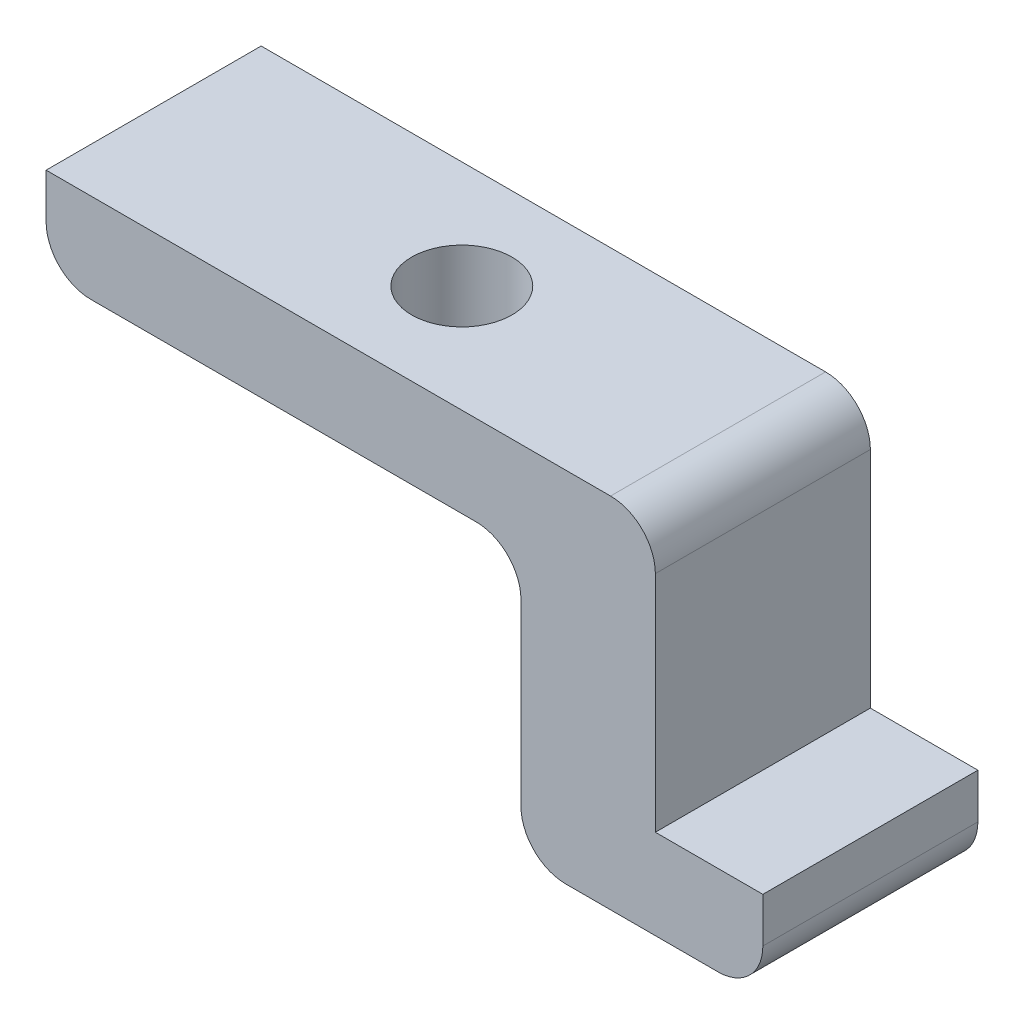
ISO-10303-21;
HEADER;
FILE_DESCRIPTION(('STEP AP214'),'2;1');
FILE_NAME('part.step','',(''),(''),'','','');
FILE_SCHEMA(('AUTOMOTIVE_DESIGN { 1 0 10303 214 1 1 1 1 }'));
ENDSEC;
DATA;
#1=APPLICATION_CONTEXT('core data for automotive mechanical design processes');
#2=APPLICATION_PROTOCOL_DEFINITION('international standard','automotive_design',2000,#1);
#3=PRODUCT_CONTEXT('',#1,'mechanical');
#4=PRODUCT('Part','Part','',(#3));
#5=PRODUCT_RELATED_PRODUCT_CATEGORY('part','',(#4));
#6=PRODUCT_DEFINITION_FORMATION('','',#4);
#7=PRODUCT_DEFINITION_CONTEXT('part definition',#1,'design');
#8=PRODUCT_DEFINITION('design','',#6,#7);
#9=PRODUCT_DEFINITION_SHAPE('','',#8);
#10=(LENGTH_UNIT() NAMED_UNIT(*) SI_UNIT(.MILLI.,.METRE.));
#11=(NAMED_UNIT(*) PLANE_ANGLE_UNIT() SI_UNIT($,.RADIAN.));
#12=(NAMED_UNIT(*) SI_UNIT($,.STERADIAN.) SOLID_ANGLE_UNIT());
#13=UNCERTAINTY_MEASURE_WITH_UNIT(LENGTH_MEASURE(1.E-05),#10,'distance_accuracy_value','');
#14=(GEOMETRIC_REPRESENTATION_CONTEXT(3) GLOBAL_UNCERTAINTY_ASSIGNED_CONTEXT((#13)) GLOBAL_UNIT_ASSIGNED_CONTEXT((#10,
#11,#12)) REPRESENTATION_CONTEXT('',''));
#15=CARTESIAN_POINT('',(0.,0.,0.));
#16=DIRECTION('',(0.,0.,1.));
#17=DIRECTION('',(1.,0.,0.));
#18=AXIS2_PLACEMENT_3D('',#15,#16,#17);
#19=CARTESIAN_POINT('',(-4.7625,-3.175,7.62));
#20=DIRECTION('',(0.,1.,0.));
#21=DIRECTION('',(0.,0.,1.));
#22=AXIS2_PLACEMENT_3D('',#19,#20,#21);
#23=PLANE('',#22);
#24=DIRECTION('',(1.,0.,0.));
#25=VECTOR('',#24,1.);
#26=CARTESIAN_POINT('',(-4.7625,-3.175,0.));
#27=LINE('',#26,#25);
#28=CARTESIAN_POINT('',(-3.175,-3.175,0.));
#29=VERTEX_POINT('',#28);
#30=CARTESIAN_POINT('',(2.2225,-3.175,0.));
#31=VERTEX_POINT('',#30);
#32=EDGE_CURVE('E176',#29,#31,#27,.T.);
#33=ORIENTED_EDGE('',*,*,#32,.T.);
#34=DIRECTION('',(0.,0.,-1.));
#35=VECTOR('',#34,1.);
#36=CARTESIAN_POINT('',(2.2225,-3.175,7.62));
#37=LINE('',#36,#35);
#38=CARTESIAN_POINT('',(2.2225,-3.175,7.62));
#39=VERTEX_POINT('',#38);
#40=EDGE_CURVE('E226',#31,#39,#37,.F.);
#41=ORIENTED_EDGE('',*,*,#40,.T.);
#42=DIRECTION('',(1.,0.,0.));
#43=VECTOR('',#42,1.);
#44=CARTESIAN_POINT('',(-4.7625,-3.175,7.62));
#45=LINE('',#44,#43);
#46=CARTESIAN_POINT('',(-3.175,-3.175,7.62));
#47=VERTEX_POINT('',#46);
#48=EDGE_CURVE('E146',#47,#39,#45,.T.);
#49=ORIENTED_EDGE('',*,*,#48,.F.);
#50=DIRECTION('',(0.,0.,-1.));
#51=VECTOR('',#50,1.);
#52=CARTESIAN_POINT('',(-3.175,-3.175,7.62));
#53=LINE('',#52,#51);
#54=EDGE_CURVE('E227',#47,#29,#53,.T.);
#55=ORIENTED_EDGE('',*,*,#54,.T.);
#56=EDGE_LOOP('',(#33,#41,#49,#55));
#57=FACE_BOUND('',#56,.T.);
#58=ADVANCED_FACE('F41',(#57),#23,.F.);
#59=CARTESIAN_POINT('',(3.81,-3.175,7.62));
#60=DIRECTION('',(-1.,0.,0.));
#61=DIRECTION('',(0.,-1.,0.));
#62=AXIS2_PLACEMENT_3D('',#59,#60,#61);
#63=PLANE('',#62);
#64=DIRECTION('',(0.,1.,0.));
#65=VECTOR('',#64,1.);
#66=CARTESIAN_POINT('',(3.81,-3.175,7.62));
#67=LINE('',#66,#65);
#68=CARTESIAN_POINT('',(3.81,-1.5875,7.62));
#69=VERTEX_POINT('',#68);
#70=CARTESIAN_POINT('',(3.81,0.,7.62));
#71=VERTEX_POINT('',#70);
#72=EDGE_CURVE('E133',#69,#71,#67,.T.);
#73=ORIENTED_EDGE('',*,*,#72,.F.);
#74=DIRECTION('',(0.,0.,-1.));
#75=VECTOR('',#74,1.);
#76=CARTESIAN_POINT('',(3.81,-1.5875,7.62));
#77=LINE('',#76,#75);
#78=CARTESIAN_POINT('',(3.81,-1.5875,0.));
#79=VERTEX_POINT('',#78);
#80=EDGE_CURVE('E221',#69,#79,#77,.T.);
#81=ORIENTED_EDGE('',*,*,#80,.T.);
#82=DIRECTION('',(0.,1.,0.));
#83=VECTOR('',#82,1.);
#84=CARTESIAN_POINT('',(3.81,-3.175,0.));
#85=LINE('',#84,#83);
#86=CARTESIAN_POINT('',(3.81,0.,0.));
#87=VERTEX_POINT('',#86);
#88=EDGE_CURVE('E152',#79,#87,#85,.T.);
#89=ORIENTED_EDGE('',*,*,#88,.T.);
#90=DIRECTION('',(0.,0.,-1.));
#91=VECTOR('',#90,1.);
#92=CARTESIAN_POINT('',(3.81,0.,7.62));
#93=LINE('',#92,#91);
#94=EDGE_CURVE('E151',#71,#87,#93,.T.);
#95=ORIENTED_EDGE('',*,*,#94,.F.);
#96=EDGE_LOOP('',(#73,#81,#89,#95));
#97=FACE_BOUND('',#96,.T.);
#98=ADVANCED_FACE('F155',(#97),#63,.F.);
#99=CARTESIAN_POINT('',(0.,0.,7.62));
#100=DIRECTION('',(0.,1.,0.));
#101=DIRECTION('',(0.,0.,1.));
#102=AXIS2_PLACEMENT_3D('',#99,#100,#101);
#103=PLANE('',#102);
#104=DIRECTION('',(1.,0.,0.));
#105=VECTOR('',#104,1.);
#106=CARTESIAN_POINT('',(0.,0.,0.));
#107=LINE('',#106,#105);
#108=CARTESIAN_POINT('',(0.,0.,0.));
#109=VERTEX_POINT('',#108);
#110=EDGE_CURVE('E185',#109,#87,#107,.T.);
#111=ORIENTED_EDGE('',*,*,#110,.F.);
#112=DIRECTION('',(0.,0.,-1.));
#113=VECTOR('',#112,1.);
#114=CARTESIAN_POINT('',(0.,0.,7.62));
#115=LINE('',#114,#113);
#116=CARTESIAN_POINT('',(0.,0.,7.62));
#117=VERTEX_POINT('',#116);
#118=EDGE_CURVE('E157',#117,#109,#115,.T.);
#119=ORIENTED_EDGE('',*,*,#118,.F.);
#120=DIRECTION('',(1.,0.,0.));
#121=VECTOR('',#120,1.);
#122=CARTESIAN_POINT('',(0.,0.,7.62));
#123=LINE('',#122,#121);
#124=EDGE_CURVE('E143',#117,#71,#123,.T.);
#125=ORIENTED_EDGE('',*,*,#124,.T.);
#126=ORIENTED_EDGE('',*,*,#94,.T.);
#127=EDGE_LOOP('',(#111,#119,#125,#126));
#128=FACE_BOUND('',#127,.T.);
#129=ADVANCED_FACE('F161',(#128),#103,.T.);
#130=CARTESIAN_POINT('',(0.,0.,7.62));
#131=DIRECTION('',(-1.,0.,0.));
#132=DIRECTION('',(0.,0.,1.));
#133=AXIS2_PLACEMENT_3D('',#130,#131,#132);
#134=PLANE('',#133);
#135=DIRECTION('',(0.,1.,0.));
#136=VECTOR('',#135,1.);
#137=CARTESIAN_POINT('',(0.,0.,0.));
#138=LINE('',#137,#136);
#139=CARTESIAN_POINT('',(0.,7.9375,0.));
#140=VERTEX_POINT('',#139);
#141=EDGE_CURVE('E184',#109,#140,#138,.T.);
#142=ORIENTED_EDGE('',*,*,#141,.T.);
#143=DIRECTION('',(0.,0.,-1.));
#144=VECTOR('',#143,1.);
#145=CARTESIAN_POINT('',(0.,7.9375,7.62));
#146=LINE('',#145,#144);
#147=CARTESIAN_POINT('',(0.,7.9375,7.62));
#148=VERTEX_POINT('',#147);
#149=EDGE_CURVE('E233',#140,#148,#146,.F.);
#150=ORIENTED_EDGE('',*,*,#149,.T.);
#151=DIRECTION('',(0.,1.,0.));
#152=VECTOR('',#151,1.);
#153=CARTESIAN_POINT('',(0.,0.,7.62));
#154=LINE('',#153,#152);
#155=EDGE_CURVE('E162',#117,#148,#154,.T.);
#156=ORIENTED_EDGE('',*,*,#155,.F.);
#157=ORIENTED_EDGE('',*,*,#118,.T.);
#158=EDGE_LOOP('',(#142,#150,#156,#157));
#159=FACE_BOUND('',#158,.T.);
#160=ADVANCED_FACE('F275',(#159),#134,.F.);
#161=CARTESIAN_POINT('',(0.,9.525,7.62));
#162=DIRECTION('',(0.,-1.,0.));
#163=DIRECTION('',(1.,0.,0.));
#164=AXIS2_PLACEMENT_3D('',#161,#162,#163);
#165=PLANE('',#164);
#166=CARTESIAN_POINT('',(-10.668,9.525,3.81));
#167=DIRECTION('',(0.,1.,0.));
#168=DIRECTION('',(-1.,0.,0.));
#169=AXIS2_PLACEMENT_3D('',#166,#167,#168);
#170=CIRCLE('',#169,1.778);
#171=CARTESIAN_POINT('',(-12.446,9.525,3.81));
#172=VERTEX_POINT('',#171);
#173=EDGE_CURVE('E205',#172,#172,#170,.T.);
#174=ORIENTED_EDGE('',*,*,#173,.F.);
#175=EDGE_LOOP('',(#174));
#176=FACE_BOUND('',#175,.T.);
#177=DIRECTION('',(-1.,0.,0.));
#178=VECTOR('',#177,1.);
#179=CARTESIAN_POINT('',(0.,9.525,7.62));
#180=LINE('',#179,#178);
#181=CARTESIAN_POINT('',(-1.5875,9.525,7.62));
#182=VERTEX_POINT('',#181);
#183=CARTESIAN_POINT('',(-21.59,9.525,7.62));
#184=VERTEX_POINT('',#183);
#185=EDGE_CURVE('E164',#182,#184,#180,.T.);
#186=ORIENTED_EDGE('',*,*,#185,.F.);
#187=DIRECTION('',(0.,0.,-1.));
#188=VECTOR('',#187,1.);
#189=CARTESIAN_POINT('',(-1.5875,9.525,7.62));
#190=LINE('',#189,#188);
#191=CARTESIAN_POINT('',(-1.5875,9.525,0.));
#192=VERTEX_POINT('',#191);
#193=EDGE_CURVE('E234',#182,#192,#190,.T.);
#194=ORIENTED_EDGE('',*,*,#193,.T.);
#195=DIRECTION('',(-1.,0.,0.));
#196=VECTOR('',#195,1.);
#197=CARTESIAN_POINT('',(0.,9.525,0.));
#198=LINE('',#197,#196);
#199=CARTESIAN_POINT('',(-21.59,9.525,0.));
#200=VERTEX_POINT('',#199);
#201=EDGE_CURVE('E189',#192,#200,#198,.T.);
#202=ORIENTED_EDGE('',*,*,#201,.T.);
#203=DIRECTION('',(0.,0.,-1.));
#204=VECTOR('',#203,1.);
#205=CARTESIAN_POINT('',(-21.59,9.525,7.62));
#206=LINE('',#205,#204);
#207=EDGE_CURVE('E179',#184,#200,#206,.T.);
#208=ORIENTED_EDGE('',*,*,#207,.F.);
#209=EDGE_LOOP('',(#186,#194,#202,#208));
#210=FACE_BOUND('',#209,.T.);
#211=ADVANCED_FACE('F268',(#176,#210),#165,.F.);
#212=CARTESIAN_POINT('',(-21.59,9.525,7.62));
#213=DIRECTION('',(1.,0.,0.));
#214=DIRECTION('',(0.,0.,-1.));
#215=AXIS2_PLACEMENT_3D('',#212,#213,#214);
#216=PLANE('',#215);
#217=DIRECTION('',(0.,-1.,0.));
#218=VECTOR('',#217,1.);
#219=CARTESIAN_POINT('',(-21.59,9.525,0.));
#220=LINE('',#219,#218);
#221=CARTESIAN_POINT('',(-21.59,7.9375,0.));
#222=VERTEX_POINT('',#221);
#223=EDGE_CURVE('E186',#200,#222,#220,.T.);
#224=ORIENTED_EDGE('',*,*,#223,.T.);
#225=DIRECTION('',(0.,0.,-1.));
#226=VECTOR('',#225,1.);
#227=CARTESIAN_POINT('',(-21.59,7.9375,7.62));
#228=LINE('',#227,#226);
#229=CARTESIAN_POINT('',(-21.59,7.9375,7.62));
#230=VERTEX_POINT('',#229);
#231=EDGE_CURVE('E214',#222,#230,#228,.F.);
#232=ORIENTED_EDGE('',*,*,#231,.T.);
#233=DIRECTION('',(0.,-1.,0.));
#234=VECTOR('',#233,1.);
#235=CARTESIAN_POINT('',(-21.59,9.525,7.62));
#236=LINE('',#235,#234);
#237=EDGE_CURVE('E168',#184,#230,#236,.T.);
#238=ORIENTED_EDGE('',*,*,#237,.F.);
#239=ORIENTED_EDGE('',*,*,#207,.T.);
#240=EDGE_LOOP('',(#224,#232,#238,#239));
#241=FACE_BOUND('',#240,.T.);
#242=ADVANCED_FACE('F271',(#241),#216,.F.);
#243=CARTESIAN_POINT('',(-21.59,6.35,7.62));
#244=DIRECTION('',(0.,1.,0.));
#245=DIRECTION('',(0.,0.,1.));
#246=AXIS2_PLACEMENT_3D('',#243,#244,#245);
#247=PLANE('',#246);
#248=CARTESIAN_POINT('',(-10.668,6.35,3.81));
#249=DIRECTION('',(0.,1.,0.));
#250=DIRECTION('',(0.,0.,1.));
#251=AXIS2_PLACEMENT_3D('',#248,#249,#250);
#252=CIRCLE('',#251,1.778);
#253=CARTESIAN_POINT('',(-12.446,6.35,3.81));
#254=VERTEX_POINT('',#253);
#255=EDGE_CURVE('E177',#254,#254,#252,.T.);
#256=ORIENTED_EDGE('',*,*,#255,.T.);
#257=EDGE_LOOP('',(#256));
#258=FACE_BOUND('',#257,.T.);
#259=DIRECTION('',(1.,0.,0.));
#260=VECTOR('',#259,1.);
#261=CARTESIAN_POINT('',(-21.59,6.35,7.62));
#262=LINE('',#261,#260);
#263=CARTESIAN_POINT('',(-20.0025,6.35,7.62));
#264=VERTEX_POINT('',#263);
#265=CARTESIAN_POINT('',(-6.35,6.35,7.62));
#266=VERTEX_POINT('',#265);
#267=EDGE_CURVE('E174',#264,#266,#262,.T.);
#268=ORIENTED_EDGE('',*,*,#267,.F.);
#269=DIRECTION('',(0.,0.,-1.));
#270=VECTOR('',#269,1.);
#271=CARTESIAN_POINT('',(-20.0025,6.35,7.62));
#272=LINE('',#271,#270);
#273=CARTESIAN_POINT('',(-20.0025,6.35,0.));
#274=VERTEX_POINT('',#273);
#275=EDGE_CURVE('E204',#264,#274,#272,.T.);
#276=ORIENTED_EDGE('',*,*,#275,.T.);
#277=DIRECTION('',(1.,0.,0.));
#278=VECTOR('',#277,1.);
#279=CARTESIAN_POINT('',(-21.59,6.35,0.));
#280=LINE('',#279,#278);
#281=CARTESIAN_POINT('',(-6.35,6.35,0.));
#282=VERTEX_POINT('',#281);
#283=EDGE_CURVE('E195',#274,#282,#280,.T.);
#284=ORIENTED_EDGE('',*,*,#283,.T.);
#285=DIRECTION('',(0.,0.,-1.));
#286=VECTOR('',#285,1.);
#287=CARTESIAN_POINT('',(-6.35,6.35,7.62));
#288=LINE('',#287,#286);
#289=EDGE_CURVE('E158',#282,#266,#288,.F.);
#290=ORIENTED_EDGE('',*,*,#289,.T.);
#291=EDGE_LOOP('',(#268,#276,#284,#290));
#292=FACE_BOUND('',#291,.T.);
#293=ADVANCED_FACE('F249',(#258,#292),#247,.F.);
#294=CARTESIAN_POINT('',(-4.7625,6.35,7.62));
#295=DIRECTION('',(1.,0.,0.));
#296=DIRECTION('',(0.,1.,0.));
#297=AXIS2_PLACEMENT_3D('',#294,#295,#296);
#298=PLANE('',#297);
#299=DIRECTION('',(0.,-1.,0.));
#300=VECTOR('',#299,1.);
#301=CARTESIAN_POINT('',(-4.7625,6.35,7.62));
#302=LINE('',#301,#300);
#303=CARTESIAN_POINT('',(-4.7625,4.7625,7.62));
#304=VERTEX_POINT('',#303);
#305=CARTESIAN_POINT('',(-4.7625,-1.5875,7.62));
#306=VERTEX_POINT('',#305);
#307=EDGE_CURVE('E171',#304,#306,#302,.T.);
#308=ORIENTED_EDGE('',*,*,#307,.F.);
#309=DIRECTION('',(0.,0.,-1.));
#310=VECTOR('',#309,1.);
#311=CARTESIAN_POINT('',(-4.7625,4.7625,0.));
#312=LINE('',#311,#310);
#313=CARTESIAN_POINT('',(-4.7625,4.7625,0.));
#314=VERTEX_POINT('',#313);
#315=EDGE_CURVE('E240',#304,#314,#312,.T.);
#316=ORIENTED_EDGE('',*,*,#315,.T.);
#317=DIRECTION('',(0.,-1.,0.));
#318=VECTOR('',#317,1.);
#319=CARTESIAN_POINT('',(-4.7625,6.35,0.));
#320=LINE('',#319,#318);
#321=CARTESIAN_POINT('',(-4.7625,-1.5875,0.));
#322=VERTEX_POINT('',#321);
#323=EDGE_CURVE('E193',#314,#322,#320,.T.);
#324=ORIENTED_EDGE('',*,*,#323,.T.);
#325=DIRECTION('',(0.,0.,-1.));
#326=VECTOR('',#325,1.);
#327=CARTESIAN_POINT('',(-4.7625,-1.5875,7.62));
#328=LINE('',#327,#326);
#329=EDGE_CURVE('E57',#322,#306,#328,.F.);
#330=ORIENTED_EDGE('',*,*,#329,.T.);
#331=EDGE_LOOP('',(#308,#316,#324,#330));
#332=FACE_BOUND('',#331,.T.);
#333=ADVANCED_FACE('F253',(#332),#298,.F.);
#334=CARTESIAN_POINT('',(0.,0.,7.62));
#335=DIRECTION('',(0.,0.,1.));
#336=DIRECTION('',(1.,0.,0.));
#337=AXIS2_PLACEMENT_3D('',#334,#335,#336);
#338=PLANE('',#337);
#339=ORIENTED_EDGE('',*,*,#237,.T.);
#340=CARTESIAN_POINT('',(-20.0025,7.9375,7.62));
#341=DIRECTION('',(0.,0.,1.));
#342=DIRECTION('',(1.,0.,0.));
#343=AXIS2_PLACEMENT_3D('',#340,#341,#342);
#344=CIRCLE('',#343,1.5875);
#345=EDGE_CURVE('E225',#230,#264,#344,.T.);
#346=ORIENTED_EDGE('',*,*,#345,.T.);
#347=ORIENTED_EDGE('',*,*,#267,.T.);
#348=CARTESIAN_POINT('',(-6.35,4.7625,7.62));
#349=DIRECTION('',(0.,0.,1.));
#350=DIRECTION('',(1.,0.,0.));
#351=AXIS2_PLACEMENT_3D('',#348,#349,#350);
#352=CIRCLE('',#351,1.5875);
#353=EDGE_CURVE('E11',#266,#304,#352,.F.);
#354=ORIENTED_EDGE('',*,*,#353,.T.);
#355=ORIENTED_EDGE('',*,*,#307,.T.);
#356=CARTESIAN_POINT('',(-3.175,-1.5875,7.62));
#357=DIRECTION('',(0.,0.,1.));
#358=DIRECTION('',(1.,0.,0.));
#359=AXIS2_PLACEMENT_3D('',#356,#357,#358);
#360=CIRCLE('',#359,1.5875);
#361=EDGE_CURVE('E220',#306,#47,#360,.T.);
#362=ORIENTED_EDGE('',*,*,#361,.T.);
#363=ORIENTED_EDGE('',*,*,#48,.T.);
#364=CARTESIAN_POINT('',(2.2225,-1.5875,7.62));
#365=DIRECTION('',(0.,0.,1.));
#366=DIRECTION('',(1.,0.,0.));
#367=AXIS2_PLACEMENT_3D('',#364,#365,#366);
#368=CIRCLE('',#367,1.5875);
#369=EDGE_CURVE('E145',#39,#69,#368,.T.);
#370=ORIENTED_EDGE('',*,*,#369,.T.);
#371=ORIENTED_EDGE('',*,*,#72,.T.);
#372=ORIENTED_EDGE('',*,*,#124,.F.);
#373=ORIENTED_EDGE('',*,*,#155,.T.);
#374=CARTESIAN_POINT('',(-1.5875,7.9375,7.62));
#375=DIRECTION('',(0.,0.,1.));
#376=DIRECTION('',(1.,0.,0.));
#377=AXIS2_PLACEMENT_3D('',#374,#375,#376);
#378=CIRCLE('',#377,1.5875);
#379=EDGE_CURVE('E218',#148,#182,#378,.T.);
#380=ORIENTED_EDGE('',*,*,#379,.T.);
#381=ORIENTED_EDGE('',*,*,#185,.T.);
#382=EDGE_LOOP('',(#339,#346,#347,#354,#355,#362,#363,#370,#371,#372,#373,#380,#381));
#383=FACE_BOUND('',#382,.T.);
#384=ADVANCED_FACE('F139',(#383),#338,.T.);
#385=CARTESIAN_POINT('',(0.,0.,0.));
#386=DIRECTION('',(0.,0.,1.));
#387=DIRECTION('',(1.,0.,0.));
#388=AXIS2_PLACEMENT_3D('',#385,#386,#387);
#389=PLANE('',#388);
#390=ORIENTED_EDGE('',*,*,#283,.F.);
#391=CARTESIAN_POINT('',(-20.0025,7.9375,0.));
#392=DIRECTION('',(0.,0.,1.));
#393=DIRECTION('',(1.,0.,0.));
#394=AXIS2_PLACEMENT_3D('',#391,#392,#393);
#395=CIRCLE('',#394,1.5875);
#396=EDGE_CURVE('E213',#274,#222,#395,.F.);
#397=ORIENTED_EDGE('',*,*,#396,.T.);
#398=ORIENTED_EDGE('',*,*,#223,.F.);
#399=ORIENTED_EDGE('',*,*,#201,.F.);
#400=CARTESIAN_POINT('',(-1.5875,7.9375,0.));
#401=DIRECTION('',(0.,0.,1.));
#402=DIRECTION('',(1.,0.,0.));
#403=AXIS2_PLACEMENT_3D('',#400,#401,#402);
#404=CIRCLE('',#403,1.5875);
#405=EDGE_CURVE('E207',#192,#140,#404,.F.);
#406=ORIENTED_EDGE('',*,*,#405,.T.);
#407=ORIENTED_EDGE('',*,*,#141,.F.);
#408=ORIENTED_EDGE('',*,*,#110,.T.);
#409=ORIENTED_EDGE('',*,*,#88,.F.);
#410=CARTESIAN_POINT('',(2.2225,-1.5875,0.));
#411=DIRECTION('',(0.,0.,1.));
#412=DIRECTION('',(1.,0.,0.));
#413=AXIS2_PLACEMENT_3D('',#410,#411,#412);
#414=CIRCLE('',#413,1.5875);
#415=EDGE_CURVE('E211',#79,#31,#414,.F.);
#416=ORIENTED_EDGE('',*,*,#415,.T.);
#417=ORIENTED_EDGE('',*,*,#32,.F.);
#418=CARTESIAN_POINT('',(-3.175,-1.5875,0.));
#419=DIRECTION('',(0.,0.,1.));
#420=DIRECTION('',(1.,0.,0.));
#421=AXIS2_PLACEMENT_3D('',#418,#419,#420);
#422=CIRCLE('',#421,1.5875);
#423=EDGE_CURVE('E210',#29,#322,#422,.F.);
#424=ORIENTED_EDGE('',*,*,#423,.T.);
#425=ORIENTED_EDGE('',*,*,#323,.F.);
#426=CARTESIAN_POINT('',(-6.35,4.7625,0.));
#427=DIRECTION('',(0.,0.,1.));
#428=DIRECTION('',(1.,0.,0.));
#429=AXIS2_PLACEMENT_3D('',#426,#427,#428);
#430=CIRCLE('',#429,1.5875);
#431=EDGE_CURVE('E47',#314,#282,#430,.T.);
#432=ORIENTED_EDGE('',*,*,#431,.T.);
#433=EDGE_LOOP('',(#390,#397,#398,#399,#406,#407,#408,#409,#416,#417,#424,#425,#432));
#434=FACE_BOUND('',#433,.T.);
#435=ADVANCED_FACE('F244',(#434),#389,.F.);
#436=CARTESIAN_POINT('',(-10.668,-3.175,3.81));
#437=DIRECTION('',(0.,1.,0.));
#438=DIRECTION('',(-1.,0.,0.));
#439=AXIS2_PLACEMENT_3D('',#436,#437,#438);
#440=CYLINDRICAL_SURFACE('',#439,1.778);
#441=CARTESIAN_POINT('',(-12.446,9.525,3.81));
#442=CARTESIAN_POINT('',(-12.446,9.49192708333333,3.81));
#443=CARTESIAN_POINT('',(-12.446,9.45885416666667,3.81));
#444=CARTESIAN_POINT('',(-12.446,9.39270833333333,3.81));
#445=CARTESIAN_POINT('',(-12.446,9.35963541666667,3.81));
#446=CARTESIAN_POINT('',(-12.446,9.29348958333333,3.81));
#447=CARTESIAN_POINT('',(-12.446,9.26041666666667,3.81));
#448=CARTESIAN_POINT('',(-12.446,9.19427083333333,3.81));
#449=CARTESIAN_POINT('',(-12.446,9.16119791666667,3.81));
#450=CARTESIAN_POINT('',(-12.446,9.09505208333333,3.81));
#451=CARTESIAN_POINT('',(-12.446,9.06197916666667,3.81));
#452=CARTESIAN_POINT('',(-12.446,8.99583333333333,3.81));
#453=CARTESIAN_POINT('',(-12.446,8.96276041666667,3.81));
#454=CARTESIAN_POINT('',(-12.446,8.89661458333333,3.81));
#455=CARTESIAN_POINT('',(-12.446,8.86354166666666,3.81));
#456=CARTESIAN_POINT('',(-12.446,8.79739583333333,3.81));
#457=CARTESIAN_POINT('',(-12.446,8.76432291666667,3.81));
#458=CARTESIAN_POINT('',(-12.446,8.69817708333333,3.81));
#459=CARTESIAN_POINT('',(-12.446,8.66510416666667,3.81));
#460=CARTESIAN_POINT('',(-12.446,8.59895833333333,3.81));
#461=CARTESIAN_POINT('',(-12.446,8.56588541666667,3.81));
#462=CARTESIAN_POINT('',(-12.446,8.49973958333333,3.81));
#463=CARTESIAN_POINT('',(-12.446,8.46666666666667,3.81));
#464=CARTESIAN_POINT('',(-12.446,8.40052083333333,3.81));
#465=CARTESIAN_POINT('',(-12.446,8.36744791666667,3.81));
#466=CARTESIAN_POINT('',(-12.446,8.30130208333333,3.81));
#467=CARTESIAN_POINT('',(-12.446,8.26822916666666,3.81));
#468=CARTESIAN_POINT('',(-12.446,8.20208333333333,3.81));
#469=CARTESIAN_POINT('',(-12.446,8.16901041666667,3.81));
#470=CARTESIAN_POINT('',(-12.446,8.10286458333333,3.81));
#471=CARTESIAN_POINT('',(-12.446,8.06979166666666,3.81));
#472=CARTESIAN_POINT('',(-12.446,8.00364583333333,3.81));
#473=CARTESIAN_POINT('',(-12.446,7.97057291666667,3.81));
#474=CARTESIAN_POINT('',(-12.446,7.90442708333333,3.81));
#475=CARTESIAN_POINT('',(-12.446,7.87135416666667,3.81));
#476=CARTESIAN_POINT('',(-12.446,7.80520833333333,3.81));
#477=CARTESIAN_POINT('',(-12.446,7.77213541666667,3.81));
#478=CARTESIAN_POINT('',(-12.446,7.70598958333333,3.81));
#479=CARTESIAN_POINT('',(-12.446,7.67291666666666,3.81));
#480=CARTESIAN_POINT('',(-12.446,7.60677083333333,3.81));
#481=CARTESIAN_POINT('',(-12.446,7.57369791666666,3.81));
#482=CARTESIAN_POINT('',(-12.446,7.50755208333333,3.81));
#483=CARTESIAN_POINT('',(-12.446,7.47447916666666,3.81));
#484=CARTESIAN_POINT('',(-12.446,7.40833333333333,3.81));
#485=CARTESIAN_POINT('',(-12.446,7.37526041666666,3.81));
#486=CARTESIAN_POINT('',(-12.446,7.30911458333333,3.81));
#487=CARTESIAN_POINT('',(-12.446,7.27604166666666,3.81));
#488=CARTESIAN_POINT('',(-12.446,7.20989583333333,3.81));
#489=CARTESIAN_POINT('',(-12.446,7.17682291666666,3.81));
#490=CARTESIAN_POINT('',(-12.446,7.11067708333333,3.81));
#491=CARTESIAN_POINT('',(-12.446,7.07760416666666,3.81));
#492=CARTESIAN_POINT('',(-12.446,7.01145833333333,3.81));
#493=CARTESIAN_POINT('',(-12.446,6.97838541666666,3.81));
#494=CARTESIAN_POINT('',(-12.446,6.91223958333333,3.81));
#495=CARTESIAN_POINT('',(-12.446,6.87916666666666,3.81));
#496=CARTESIAN_POINT('',(-12.446,6.81302083333333,3.81));
#497=CARTESIAN_POINT('',(-12.446,6.77994791666666,3.81));
#498=CARTESIAN_POINT('',(-12.446,6.71380208333333,3.81));
#499=CARTESIAN_POINT('',(-12.446,6.68072916666666,3.81));
#500=CARTESIAN_POINT('',(-12.446,6.61458333333333,3.81));
#501=CARTESIAN_POINT('',(-12.446,6.58151041666666,3.81));
#502=CARTESIAN_POINT('',(-12.446,6.51536458333333,3.81));
#503=CARTESIAN_POINT('',(-12.446,6.48229166666666,3.81));
#504=CARTESIAN_POINT('',(-12.446,6.41614583333333,3.81));
#505=CARTESIAN_POINT('',(-12.446,6.38307291666666,3.81));
#506=CARTESIAN_POINT('',(-12.446,6.35,3.81));
#507=B_SPLINE_CURVE_WITH_KNOTS('',3,(#441,#442,#443,#444,#445,#446,#447,#448,#449,#450,#451,
#452,#453,#454,#455,#456,#457,#458,#459,#460,#461,#462,#463,#464,#465,#466,#467,#468,#469,#470,
#471,#472,#473,#474,#475,#476,#477,#478,#479,#480,#481,#482,#483,#484,#485,#486,#487,#488,#489,
#490,#491,#492,#493,#494,#495,#496,#497,#498,#499,#500,#501,#502,#503,#504,#505,#506),
.UNSPECIFIED.,.F.,.F.,(4,2,2,2,2,2,2,2,2,2,2,2,2,2,2,2,2,2,2,2,2,2,2,2,2,2,2,2,2,2,2,2,4),(0.,
0.0992187499999995,0.198437500000001,0.29765625,0.396875000000001,0.496093750000001,0.5953125,
0.694531250000002,0.793750000000001,0.892968750000001,0.992187500000002,1.09140625,1.190625,
1.28984375,1.3890625,1.48828125,1.5875,1.68671875,1.7859375,1.88515625,1.984375,2.08359375,
2.1828125,2.28203125,2.38125,2.48046875,2.5796875,2.67890625,2.778125,2.87734375,2.9765625,
3.07578125,3.175),.UNSPECIFIED.);
#508=EDGE_CURVE('BSEAM264',#172,#254,#507,.T.);
#509=ORIENTED_EDGE('',*,*,#173,.T.);
#510=ORIENTED_EDGE('',*,*,#255,.F.);
#511=ORIENTED_EDGE('',*,*,#508,.T.);
#512=ORIENTED_EDGE('',*,*,#508,.F.);
#513=EDGE_LOOP('',(#509,#511,#510,#512));
#514=FACE_BOUND('',#513,.T.);
#515=ADVANCED_FACE('F264',(#514),#440,.F.);
#516=CARTESIAN_POINT('',(-20.0025,7.9375,7.62));
#517=DIRECTION('',(0.,0.,-1.));
#518=DIRECTION('',(-1.,0.,0.));
#519=AXIS2_PLACEMENT_3D('',#516,#517,#518);
#520=CYLINDRICAL_SURFACE('',#519,1.5875);
#521=ORIENTED_EDGE('',*,*,#345,.F.);
#522=ORIENTED_EDGE('',*,*,#231,.F.);
#523=ORIENTED_EDGE('',*,*,#396,.F.);
#524=ORIENTED_EDGE('',*,*,#275,.F.);
#525=EDGE_LOOP('',(#521,#522,#523,#524));
#526=FACE_BOUND('',#525,.T.);
#527=ADVANCED_FACE('F298',(#526),#520,.T.);
#528=CARTESIAN_POINT('',(2.2225,-1.5875,7.62));
#529=DIRECTION('',(0.,0.,-1.));
#530=DIRECTION('',(-1.,0.,0.));
#531=AXIS2_PLACEMENT_3D('',#528,#529,#530);
#532=CYLINDRICAL_SURFACE('',#531,1.5875);
#533=ORIENTED_EDGE('',*,*,#369,.F.);
#534=ORIENTED_EDGE('',*,*,#40,.F.);
#535=ORIENTED_EDGE('',*,*,#415,.F.);
#536=ORIENTED_EDGE('',*,*,#80,.F.);
#537=EDGE_LOOP('',(#533,#534,#535,#536));
#538=FACE_BOUND('',#537,.T.);
#539=ADVANCED_FACE('F257',(#538),#532,.T.);
#540=CARTESIAN_POINT('',(-1.5875,7.9375,7.62));
#541=DIRECTION('',(0.,0.,-1.));
#542=DIRECTION('',(-1.,0.,0.));
#543=AXIS2_PLACEMENT_3D('',#540,#541,#542);
#544=CYLINDRICAL_SURFACE('',#543,1.5875);
#545=ORIENTED_EDGE('',*,*,#379,.F.);
#546=ORIENTED_EDGE('',*,*,#149,.F.);
#547=ORIENTED_EDGE('',*,*,#405,.F.);
#548=ORIENTED_EDGE('',*,*,#193,.F.);
#549=EDGE_LOOP('',(#545,#546,#547,#548));
#550=FACE_BOUND('',#549,.T.);
#551=ADVANCED_FACE('F282',(#550),#544,.T.);
#552=CARTESIAN_POINT('',(-6.35,4.7625,7.62));
#553=DIRECTION('',(0.,0.,1.));
#554=DIRECTION('',(1.,0.,0.));
#555=AXIS2_PLACEMENT_3D('',#552,#553,#554);
#556=CYLINDRICAL_SURFACE('',#555,1.5875);
#557=ORIENTED_EDGE('',*,*,#353,.F.);
#558=ORIENTED_EDGE('',*,*,#289,.F.);
#559=ORIENTED_EDGE('',*,*,#431,.F.);
#560=ORIENTED_EDGE('',*,*,#315,.F.);
#561=EDGE_LOOP('',(#557,#558,#559,#560));
#562=FACE_BOUND('',#561,.T.);
#563=ADVANCED_FACE('F248',(#562),#556,.F.);
#564=CARTESIAN_POINT('',(-3.175,-1.5875,7.62));
#565=DIRECTION('',(0.,0.,-1.));
#566=DIRECTION('',(-1.,0.,0.));
#567=AXIS2_PLACEMENT_3D('',#564,#565,#566);
#568=CYLINDRICAL_SURFACE('',#567,1.5875);
#569=ORIENTED_EDGE('',*,*,#361,.F.);
#570=ORIENTED_EDGE('',*,*,#329,.F.);
#571=ORIENTED_EDGE('',*,*,#423,.F.);
#572=ORIENTED_EDGE('',*,*,#54,.F.);
#573=EDGE_LOOP('',(#569,#570,#571,#572));
#574=FACE_BOUND('',#573,.T.);
#575=ADVANCED_FACE('F43',(#574),#568,.T.);
#576=CLOSED_SHELL('',(#58,#98,#129,#160,#211,#242,#293,#333,#384,#435,#515,#527,#539,#551,#563,#575));
#577=MANIFOLD_SOLID_BREP('B2',#576);
#578=ADVANCED_BREP_SHAPE_REPRESENTATION('',(#18,#577),#14);
#579=SHAPE_DEFINITION_REPRESENTATION(#9,#578);
ENDSEC;
END-ISO-10303-21;
